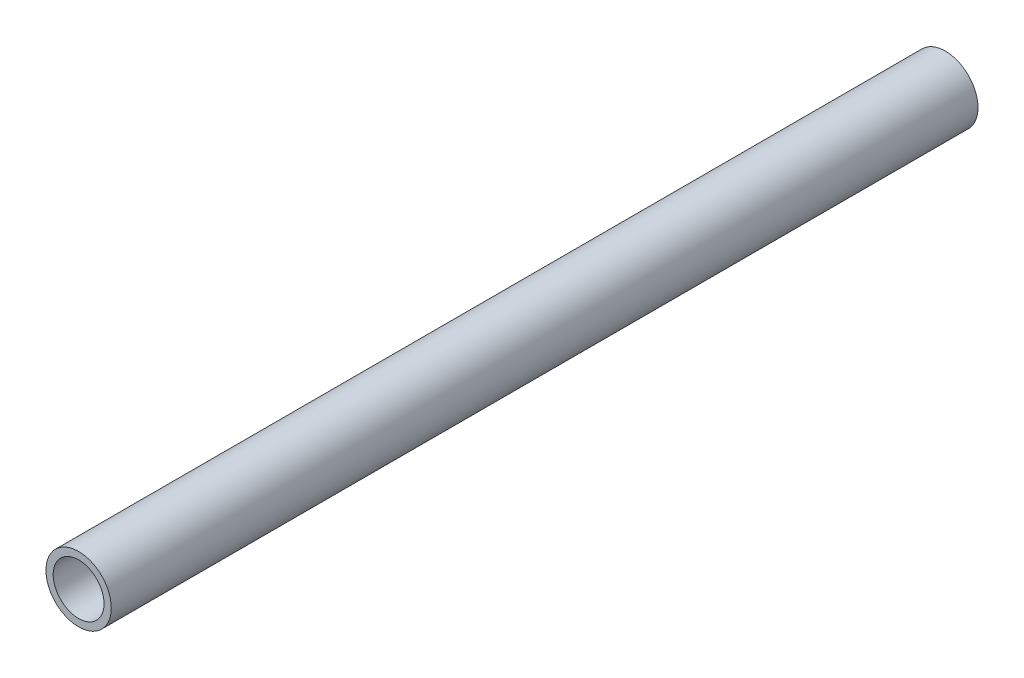
ISO-10303-21;
HEADER;
FILE_DESCRIPTION(('STEP AP214'),'2;1');
FILE_NAME('part.step','',(''),(''),'','','');
FILE_SCHEMA(('AUTOMOTIVE_DESIGN { 1 0 10303 214 1 1 1 1 }'));
ENDSEC;
DATA;
#1=APPLICATION_CONTEXT('core data for automotive mechanical design processes');
#2=APPLICATION_PROTOCOL_DEFINITION('international standard','automotive_design',2000,#1);
#3=PRODUCT_CONTEXT('',#1,'mechanical');
#4=PRODUCT('Part','Part','',(#3));
#5=PRODUCT_RELATED_PRODUCT_CATEGORY('part','',(#4));
#6=PRODUCT_DEFINITION_FORMATION('','',#4);
#7=PRODUCT_DEFINITION_CONTEXT('part definition',#1,'design');
#8=PRODUCT_DEFINITION('design','',#6,#7);
#9=PRODUCT_DEFINITION_SHAPE('','',#8);
#10=(LENGTH_UNIT() NAMED_UNIT(*) SI_UNIT(.MILLI.,.METRE.));
#11=(NAMED_UNIT(*) PLANE_ANGLE_UNIT() SI_UNIT($,.RADIAN.));
#12=(NAMED_UNIT(*) SI_UNIT($,.STERADIAN.) SOLID_ANGLE_UNIT());
#13=UNCERTAINTY_MEASURE_WITH_UNIT(LENGTH_MEASURE(1.E-05),#10,'distance_accuracy_value','');
#14=(GEOMETRIC_REPRESENTATION_CONTEXT(3) GLOBAL_UNCERTAINTY_ASSIGNED_CONTEXT((#13)) GLOBAL_UNIT_ASSIGNED_CONTEXT((#10,
#11,#12)) REPRESENTATION_CONTEXT('',''));
#15=CARTESIAN_POINT('',(0.,0.,0.));
#16=DIRECTION('',(0.,0.,1.));
#17=DIRECTION('',(1.,0.,0.));
#18=AXIS2_PLACEMENT_3D('',#15,#16,#17);
#19=CARTESIAN_POINT('',(0.,0.,238.73));
#20=DIRECTION('',(0.,0.,1.));
#21=DIRECTION('',(1.,0.,0.));
#22=AXIS2_PLACEMENT_3D('',#19,#20,#21);
#23=PLANE('',#22);
#24=CARTESIAN_POINT('',(0.,0.,238.73));
#25=DIRECTION('',(0.,0.,1.));
#26=DIRECTION('',(1.,0.,0.));
#27=AXIS2_PLACEMENT_3D('',#24,#25,#26);
#28=CIRCLE('',#27,9.);
#29=CARTESIAN_POINT('',(9.,0.,238.73));
#30=VERTEX_POINT('',#29);
#31=EDGE_CURVE('E10',#30,#30,#28,.T.);
#32=ORIENTED_EDGE('',*,*,#31,.T.);
#33=EDGE_LOOP('',(#32));
#34=FACE_BOUND('',#33,.T.);
#35=CARTESIAN_POINT('',(0.,0.,238.73));
#36=DIRECTION('',(0.,0.,1.));
#37=DIRECTION('',(1.,0.,0.));
#38=AXIS2_PLACEMENT_3D('',#35,#36,#37);
#39=CIRCLE('',#38,7.);
#40=CARTESIAN_POINT('',(7.,0.,238.73));
#41=VERTEX_POINT('',#40);
#42=EDGE_CURVE('E50',#41,#41,#39,.T.);
#43=ORIENTED_EDGE('',*,*,#42,.F.);
#44=EDGE_LOOP('',(#43));
#45=FACE_BOUND('',#44,.T.);
#46=ADVANCED_FACE('F37',(#34,#45),#23,.T.);
#47=CARTESIAN_POINT('',(0.,0.,0.));
#48=DIRECTION('',(0.,0.,1.));
#49=DIRECTION('',(1.,0.,0.));
#50=AXIS2_PLACEMENT_3D('',#47,#48,#49);
#51=PLANE('',#50);
#52=CARTESIAN_POINT('',(0.,0.,0.));
#53=DIRECTION('',(0.,0.,1.));
#54=DIRECTION('',(1.,0.,0.));
#55=AXIS2_PLACEMENT_3D('',#52,#53,#54);
#56=CIRCLE('',#55,9.);
#57=CARTESIAN_POINT('',(9.,0.,0.));
#58=VERTEX_POINT('',#57);
#59=EDGE_CURVE('E41',#58,#58,#56,.T.);
#60=ORIENTED_EDGE('',*,*,#59,.F.);
#61=EDGE_LOOP('',(#60));
#62=FACE_BOUND('',#61,.T.);
#63=CARTESIAN_POINT('',(0.,0.,0.));
#64=DIRECTION('',(0.,0.,1.));
#65=DIRECTION('',(1.,0.,0.));
#66=AXIS2_PLACEMENT_3D('',#63,#64,#65);
#67=CIRCLE('',#66,7.);
#68=CARTESIAN_POINT('',(7.,0.,0.));
#69=VERTEX_POINT('',#68);
#70=EDGE_CURVE('E52',#69,#69,#67,.T.);
#71=ORIENTED_EDGE('',*,*,#70,.T.);
#72=EDGE_LOOP('',(#71));
#73=FACE_BOUND('',#72,.T.);
#74=ADVANCED_FACE('F64',(#62,#73),#51,.F.);
#75=CARTESIAN_POINT('',(0.,0.,238.73));
#76=DIRECTION('',(0.,0.,-1.));
#77=DIRECTION('',(-1.,0.,0.));
#78=AXIS2_PLACEMENT_3D('',#75,#76,#77);
#79=CYLINDRICAL_SURFACE('',#78,9.);
#80=ORIENTED_EDGE('',*,*,#31,.F.);
#81=EDGE_LOOP('',(#80));
#82=FACE_BOUND('',#81,.T.);
#83=ORIENTED_EDGE('',*,*,#59,.T.);
#84=EDGE_LOOP('',(#83));
#85=FACE_BOUND('',#84,.T.);
#86=ADVANCED_FACE('F39',(#82,#85),#79,.T.);
#87=CARTESIAN_POINT('',(0.,0.,238.73));
#88=DIRECTION('',(0.,0.,-1.));
#89=DIRECTION('',(-1.,0.,0.));
#90=AXIS2_PLACEMENT_3D('',#87,#88,#89);
#91=CYLINDRICAL_SURFACE('',#90,7.);
#92=ORIENTED_EDGE('',*,*,#42,.T.);
#93=EDGE_LOOP('',(#92));
#94=FACE_BOUND('',#93,.T.);
#95=ORIENTED_EDGE('',*,*,#70,.F.);
#96=EDGE_LOOP('',(#95));
#97=FACE_BOUND('',#96,.T.);
#98=ADVANCED_FACE('F60',(#94,#97),#91,.F.);
#99=CLOSED_SHELL('',(#46,#74,#86,#98));
#100=MANIFOLD_SOLID_BREP('B2',#99);
#101=ADVANCED_BREP_SHAPE_REPRESENTATION('',(#18,#100),#14);
#102=SHAPE_DEFINITION_REPRESENTATION(#9,#101);
ENDSEC;
END-ISO-10303-21;
